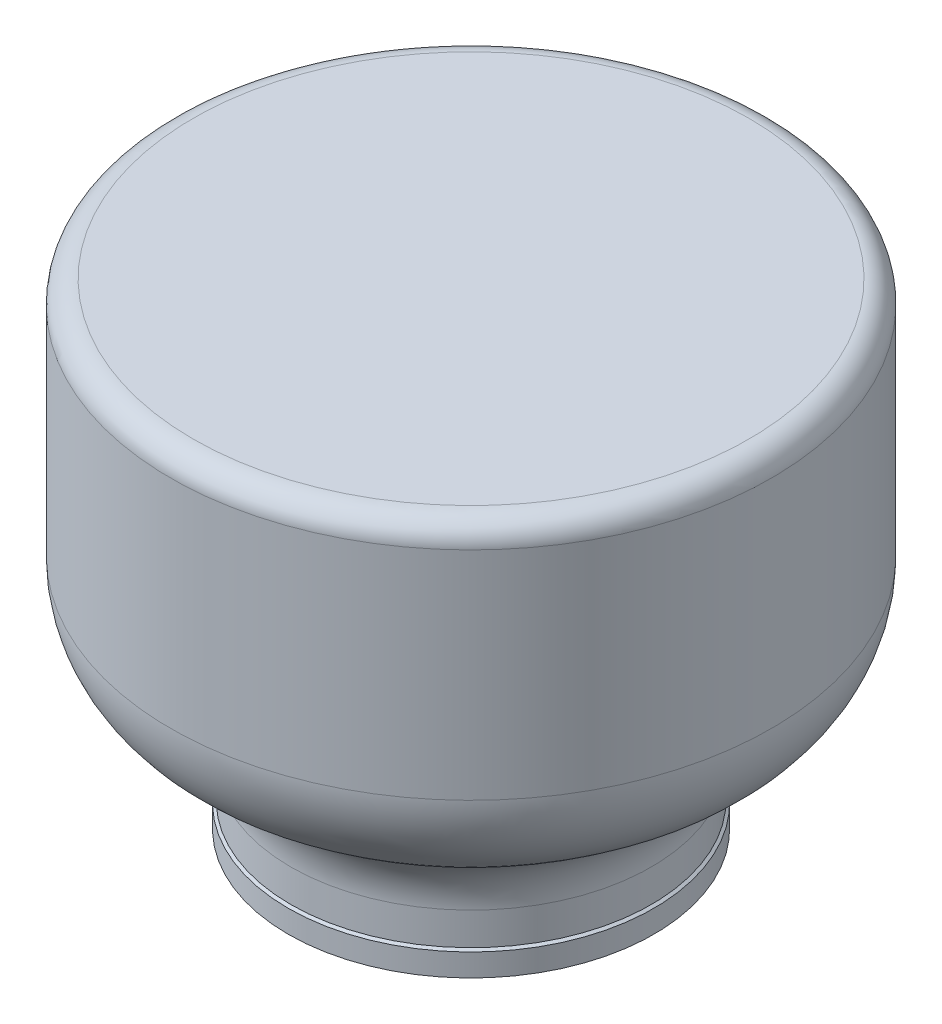
ISO-10303-21;
HEADER;
FILE_DESCRIPTION(('STEP AP214'),'2;1');
FILE_NAME('part.step','',(''),(''),'','','');
FILE_SCHEMA(('AUTOMOTIVE_DESIGN { 1 0 10303 214 1 1 1 1 }'));
ENDSEC;
DATA;
#1=APPLICATION_CONTEXT('core data for automotive mechanical design processes');
#2=APPLICATION_PROTOCOL_DEFINITION('international standard','automotive_design',2000,#1);
#3=PRODUCT_CONTEXT('',#1,'mechanical');
#4=PRODUCT('Part','Part','',(#3));
#5=PRODUCT_RELATED_PRODUCT_CATEGORY('part','',(#4));
#6=PRODUCT_DEFINITION_FORMATION('','',#4);
#7=PRODUCT_DEFINITION_CONTEXT('part definition',#1,'design');
#8=PRODUCT_DEFINITION('design','',#6,#7);
#9=PRODUCT_DEFINITION_SHAPE('','',#8);
#10=(LENGTH_UNIT() NAMED_UNIT(*) SI_UNIT(.MILLI.,.METRE.));
#11=(NAMED_UNIT(*) PLANE_ANGLE_UNIT() SI_UNIT($,.RADIAN.));
#12=(NAMED_UNIT(*) SI_UNIT($,.STERADIAN.) SOLID_ANGLE_UNIT());
#13=UNCERTAINTY_MEASURE_WITH_UNIT(LENGTH_MEASURE(1.E-05),#10,'distance_accuracy_value','');
#14=(GEOMETRIC_REPRESENTATION_CONTEXT(3) GLOBAL_UNCERTAINTY_ASSIGNED_CONTEXT((#13)) GLOBAL_UNIT_ASSIGNED_CONTEXT((#10,
#11,#12)) REPRESENTATION_CONTEXT('',''));
#15=CARTESIAN_POINT('',(0.,0.,0.));
#16=DIRECTION('',(0.,0.,1.));
#17=DIRECTION('',(1.,0.,0.));
#18=AXIS2_PLACEMENT_3D('',#15,#16,#17);
#19=CARTESIAN_POINT('',(0.,0.,0.));
#20=DIRECTION('',(0.,-1.,0.));
#21=DIRECTION('',(0.,0.,-1.));
#22=AXIS2_PLACEMENT_3D('',#19,#20,#21);
#23=CYLINDRICAL_SURFACE('',#22,22.5);
#24=CARTESIAN_POINT('',(0.,0.,0.));
#25=DIRECTION('',(0.,-1.,0.));
#26=DIRECTION('',(0.,0.,-1.));
#27=AXIS2_PLACEMENT_3D('',#24,#25,#26);
#28=CIRCLE('',#27,22.5);
#29=CARTESIAN_POINT('',(0.,0.,-22.5));
#30=VERTEX_POINT('',#29);
#31=EDGE_CURVE('E75',#30,#30,#28,.T.);
#32=ORIENTED_EDGE('',*,*,#31,.T.);
#33=EDGE_LOOP('',(#32));
#34=FACE_BOUND('',#33,.T.);
#35=CARTESIAN_POINT('',(0.,12.5,0.));
#36=DIRECTION('',(0.,-1.,0.));
#37=DIRECTION('',(0.,0.,-1.));
#38=AXIS2_PLACEMENT_3D('',#35,#36,#37);
#39=CIRCLE('',#38,22.5);
#40=CARTESIAN_POINT('',(0.,12.5,-22.5));
#41=VERTEX_POINT('',#40);
#42=EDGE_CURVE('E10',#41,#41,#39,.T.);
#43=ORIENTED_EDGE('',*,*,#42,.F.);
#44=EDGE_LOOP('',(#43));
#45=FACE_BOUND('',#44,.T.);
#46=ADVANCED_FACE('F35',(#34,#45),#23,.F.);
#47=CARTESIAN_POINT('',(0.,12.5,0.));
#48=DIRECTION('',(0.,-1.,0.));
#49=DIRECTION('',(0.,0.,-1.));
#50=AXIS2_PLACEMENT_3D('',#47,#48,#49);
#51=TOROIDAL_SURFACE('',#50,22.,0.5);
#52=ORIENTED_EDGE('',*,*,#42,.T.);
#53=EDGE_LOOP('',(#52));
#54=FACE_BOUND('',#53,.T.);
#55=CARTESIAN_POINT('',(0.,13.,0.));
#56=DIRECTION('',(0.,-1.,0.));
#57=DIRECTION('',(0.,0.,-1.));
#58=AXIS2_PLACEMENT_3D('',#55,#56,#57);
#59=CIRCLE('',#58,22.);
#60=CARTESIAN_POINT('',(0.,13.,-22.));
#61=VERTEX_POINT('',#60);
#62=EDGE_CURVE('E41',#61,#61,#59,.T.);
#63=ORIENTED_EDGE('',*,*,#62,.F.);
#64=EDGE_LOOP('',(#63));
#65=FACE_BOUND('',#64,.T.);
#66=ADVANCED_FACE('F93',(#54,#65),#51,.F.);
#67=CARTESIAN_POINT('',(0.,13.,0.));
#68=DIRECTION('',(0.,-1.,0.));
#69=DIRECTION('',(0.,0.,-1.));
#70=AXIS2_PLACEMENT_3D('',#67,#68,#69);
#71=PLANE('',#70);
#72=ORIENTED_EDGE('',*,*,#62,.T.);
#73=EDGE_LOOP('',(#72));
#74=FACE_BOUND('',#73,.T.);
#75=ADVANCED_FACE('F97',(#74),#71,.T.);
#76=CARTESIAN_POINT('',(0.,63.4278760968653,0.));
#77=DIRECTION('',(0.,1.,0.));
#78=DIRECTION('',(0.,0.,1.));
#79=AXIS2_PLACEMENT_3D('',#76,#77,#78);
#80=PLANE('',#79);
#81=CARTESIAN_POINT('',(0.,63.4278760968653,0.));
#82=DIRECTION('',(0.,-1.,0.));
#83=DIRECTION('',(0.,0.,-1.));
#84=AXIS2_PLACEMENT_3D('',#81,#82,#83);
#85=CIRCLE('',#84,37.);
#86=CARTESIAN_POINT('',(0.,63.4278760968653,-37.));
#87=VERTEX_POINT('',#86);
#88=EDGE_CURVE('E45',#87,#87,#85,.T.);
#89=ORIENTED_EDGE('',*,*,#88,.F.);
#90=EDGE_LOOP('',(#89));
#91=FACE_BOUND('',#90,.T.);
#92=ADVANCED_FACE('F101',(#91),#80,.T.);
#93=CARTESIAN_POINT('',(0.,60.4278760968653,0.));
#94=DIRECTION('',(0.,-1.,0.));
#95=DIRECTION('',(0.,0.,-1.));
#96=AXIS2_PLACEMENT_3D('',#93,#94,#95);
#97=TOROIDAL_SURFACE('',#96,37.,3.);
#98=ORIENTED_EDGE('',*,*,#88,.T.);
#99=EDGE_LOOP('',(#98));
#100=FACE_BOUND('',#99,.T.);
#101=CARTESIAN_POINT('',(0.,60.4278760968653,0.));
#102=DIRECTION('',(0.,-1.,0.));
#103=DIRECTION('',(0.,0.,-1.));
#104=AXIS2_PLACEMENT_3D('',#101,#102,#103);
#105=CIRCLE('',#104,40.);
#106=CARTESIAN_POINT('',(0.,60.4278760968653,-40.));
#107=VERTEX_POINT('',#106);
#108=EDGE_CURVE('E49',#107,#107,#105,.T.);
#109=ORIENTED_EDGE('',*,*,#108,.F.);
#110=EDGE_LOOP('',(#109));
#111=FACE_BOUND('',#110,.T.);
#112=ADVANCED_FACE('F107',(#100,#111),#97,.T.);
#113=CARTESIAN_POINT('',(0.,0.,0.));
#114=DIRECTION('',(0.,-1.,0.));
#115=DIRECTION('',(0.,0.,-1.));
#116=AXIS2_PLACEMENT_3D('',#113,#114,#115);
#117=CYLINDRICAL_SURFACE('',#116,40.);
#118=ORIENTED_EDGE('',*,*,#108,.T.);
#119=EDGE_LOOP('',(#118));
#120=FACE_BOUND('',#119,.T.);
#121=CARTESIAN_POINT('',(0.,31.5562889655761,0.));
#122=DIRECTION('',(0.,-1.,0.));
#123=DIRECTION('',(0.,0.,-1.));
#124=AXIS2_PLACEMENT_3D('',#121,#122,#123);
#125=CIRCLE('',#124,40.);
#126=CARTESIAN_POINT('',(0.,31.5562889655761,-40.));
#127=VERTEX_POINT('',#126);
#128=EDGE_CURVE('E54',#127,#127,#125,.T.);
#129=ORIENTED_EDGE('',*,*,#128,.F.);
#130=EDGE_LOOP('',(#129));
#131=FACE_BOUND('',#130,.T.);
#132=ADVANCED_FACE('F111',(#120,#131),#117,.T.);
#133=CARTESIAN_POINT('',(0.,31.5562889655761,0.));
#134=DIRECTION('',(0.,-1.,0.));
#135=DIRECTION('',(0.,0.,-1.));
#136=AXIS2_PLACEMENT_3D('',#133,#134,#135);
#137=TOROIDAL_SURFACE('',#136,25.,15.);
#138=ORIENTED_EDGE('',*,*,#128,.T.);
#139=EDGE_LOOP('',(#138));
#140=FACE_BOUND('',#139,.T.);
#141=CARTESIAN_POINT('',(0.,18.9896485668923,0.));
#142=DIRECTION('',(0.,-1.,0.));
#143=DIRECTION('',(0.,0.,-1.));
#144=AXIS2_PLACEMENT_3D('',#141,#142,#143);
#145=CIRCLE('',#144,33.1902105644586);
#146=CARTESIAN_POINT('',(0.,18.9896485668923,-33.1902105644586));
#147=VERTEX_POINT('',#146);
#148=EDGE_CURVE('E57',#147,#147,#145,.T.);
#149=ORIENTED_EDGE('',*,*,#148,.F.);
#150=EDGE_LOOP('',(#149));
#151=FACE_BOUND('',#150,.T.);
#152=ADVANCED_FACE('F115',(#140,#151),#137,.T.);
#153=CARTESIAN_POINT('',(0.,15.9588183533154,0.));
#154=DIRECTION('',(0.,1.,0.));
#155=DIRECTION('',(0.,0.,1.));
#156=AXIS2_PLACEMENT_3D('',#153,#154,#155);
#157=CONICAL_SURFACE('',#156,28.5398596236943,0.993197296529964);
#158=ORIENTED_EDGE('',*,*,#148,.T.);
#159=EDGE_LOOP('',(#158));
#160=FACE_BOUND('',#159,.T.);
#161=CARTESIAN_POINT('',(0.,15.9588183533154,0.));
#162=DIRECTION('',(0.,-1.,0.));
#163=DIRECTION('',(0.,0.,-1.));
#164=AXIS2_PLACEMENT_3D('',#161,#162,#163);
#165=CIRCLE('',#164,28.5398596236943);
#166=CARTESIAN_POINT('',(0.,15.9588183533154,-28.5398596236943));
#167=VERTEX_POINT('',#166);
#168=EDGE_CURVE('E60',#167,#167,#165,.T.);
#169=ORIENTED_EDGE('',*,*,#168,.F.);
#170=EDGE_LOOP('',(#169));
#171=FACE_BOUND('',#170,.T.);
#172=ADVANCED_FACE('F119',(#160,#171),#157,.T.);
#173=CARTESIAN_POINT('',(0.,7.58105808752617,0.));
#174=DIRECTION('',(0.,-1.,0.));
#175=DIRECTION('',(0.,0.,-1.));
#176=AXIS2_PLACEMENT_3D('',#173,#174,#175);
#177=TOROIDAL_SURFACE('',#176,34.,10.);
#178=ORIENTED_EDGE('',*,*,#168,.T.);
#179=EDGE_LOOP('',(#178));
#180=FACE_BOUND('',#179,.T.);
#181=CARTESIAN_POINT('',(0.,7.58105808752612,0.));
#182=DIRECTION('',(0.,-1.,0.));
#183=DIRECTION('',(0.,0.,-1.));
#184=AXIS2_PLACEMENT_3D('',#181,#182,#183);
#185=CIRCLE('',#184,24.);
#186=CARTESIAN_POINT('',(0.,7.58105808752612,-24.));
#187=VERTEX_POINT('',#186);
#188=EDGE_CURVE('E63',#187,#187,#185,.T.);
#189=ORIENTED_EDGE('',*,*,#188,.F.);
#190=EDGE_LOOP('',(#189));
#191=FACE_BOUND('',#190,.T.);
#192=ADVANCED_FACE('F123',(#180,#191),#177,.F.);
#193=CARTESIAN_POINT('',(0.,0.,0.));
#194=DIRECTION('',(0.,-1.,0.));
#195=DIRECTION('',(0.,0.,-1.));
#196=AXIS2_PLACEMENT_3D('',#193,#194,#195);
#197=CYLINDRICAL_SURFACE('',#196,24.);
#198=ORIENTED_EDGE('',*,*,#188,.T.);
#199=EDGE_LOOP('',(#198));
#200=FACE_BOUND('',#199,.T.);
#201=CARTESIAN_POINT('',(0.,3.25,0.));
#202=DIRECTION('',(0.,-1.,0.));
#203=DIRECTION('',(0.,0.,-1.));
#204=AXIS2_PLACEMENT_3D('',#201,#202,#203);
#205=CIRCLE('',#204,24.);
#206=CARTESIAN_POINT('',(0.,3.25,-24.));
#207=VERTEX_POINT('',#206);
#208=EDGE_CURVE('E66',#207,#207,#205,.T.);
#209=ORIENTED_EDGE('',*,*,#208,.F.);
#210=EDGE_LOOP('',(#209));
#211=FACE_BOUND('',#210,.T.);
#212=ADVANCED_FACE('F127',(#200,#211),#197,.T.);
#213=CARTESIAN_POINT('',(0.,3.,0.));
#214=DIRECTION('',(0.,-1.,0.));
#215=DIRECTION('',(0.,0.,-1.));
#216=AXIS2_PLACEMENT_3D('',#213,#214,#215);
#217=CONICAL_SURFACE('',#216,24.35,0.950546840812071);
#218=ORIENTED_EDGE('',*,*,#208,.T.);
#219=EDGE_LOOP('',(#218));
#220=FACE_BOUND('',#219,.T.);
#221=CARTESIAN_POINT('',(0.,3.,0.));
#222=DIRECTION('',(0.,-1.,0.));
#223=DIRECTION('',(0.,0.,-1.));
#224=AXIS2_PLACEMENT_3D('',#221,#222,#223);
#225=CIRCLE('',#224,24.35);
#226=CARTESIAN_POINT('',(0.,3.,-24.35));
#227=VERTEX_POINT('',#226);
#228=EDGE_CURVE('E69',#227,#227,#225,.T.);
#229=ORIENTED_EDGE('',*,*,#228,.F.);
#230=EDGE_LOOP('',(#229));
#231=FACE_BOUND('',#230,.T.);
#232=ADVANCED_FACE('F89',(#220,#231),#217,.T.);
#233=CARTESIAN_POINT('',(0.,0.,0.));
#234=DIRECTION('',(0.,-1.,0.));
#235=DIRECTION('',(0.,0.,-1.));
#236=AXIS2_PLACEMENT_3D('',#233,#234,#235);
#237=CYLINDRICAL_SURFACE('',#236,24.35);
#238=ORIENTED_EDGE('',*,*,#228,.T.);
#239=EDGE_LOOP('',(#238));
#240=FACE_BOUND('',#239,.T.);
#241=CARTESIAN_POINT('',(0.,0.,0.));
#242=DIRECTION('',(0.,-1.,0.));
#243=DIRECTION('',(0.,0.,-1.));
#244=AXIS2_PLACEMENT_3D('',#241,#242,#243);
#245=CIRCLE('',#244,24.35);
#246=CARTESIAN_POINT('',(0.,0.,-24.35));
#247=VERTEX_POINT('',#246);
#248=EDGE_CURVE('E72',#247,#247,#245,.T.);
#249=ORIENTED_EDGE('',*,*,#248,.F.);
#250=EDGE_LOOP('',(#249));
#251=FACE_BOUND('',#250,.T.);
#252=ADVANCED_FACE('F83',(#240,#251),#237,.T.);
#253=CARTESIAN_POINT('',(22.5,0.,0.));
#254=DIRECTION('',(0.,-1.,0.));
#255=DIRECTION('',(0.,0.,-1.));
#256=AXIS2_PLACEMENT_3D('',#253,#254,#255);
#257=PLANE('',#256);
#258=ORIENTED_EDGE('',*,*,#248,.T.);
#259=EDGE_LOOP('',(#258));
#260=FACE_BOUND('',#259,.T.);
#261=ORIENTED_EDGE('',*,*,#31,.F.);
#262=EDGE_LOOP('',(#261));
#263=FACE_BOUND('',#262,.T.);
#264=ADVANCED_FACE('F81',(#260,#263),#257,.T.);
#265=CLOSED_SHELL('',(#46,#66,#75,#92,#112,#132,#152,#172,#192,#212,#232,#252,#264));
#266=MANIFOLD_SOLID_BREP('B2',#265);
#267=ADVANCED_BREP_SHAPE_REPRESENTATION('',(#18,#266),#14);
#268=SHAPE_DEFINITION_REPRESENTATION(#9,#267);
ENDSEC;
END-ISO-10303-21;
